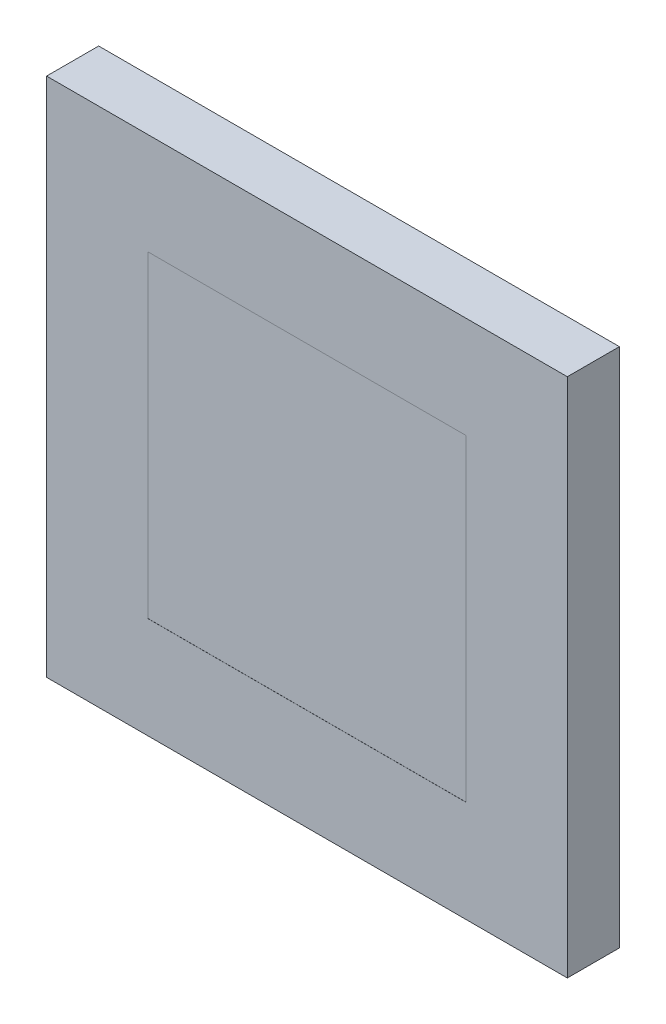
ISO-10303-21;
HEADER;
FILE_DESCRIPTION(('STEP AP214'),'2;1');
FILE_NAME('part.step','',(''),(''),'','','');
FILE_SCHEMA(('AUTOMOTIVE_DESIGN { 1 0 10303 214 1 1 1 1 }'));
ENDSEC;
DATA;
#1=APPLICATION_CONTEXT('core data for automotive mechanical design processes');
#2=APPLICATION_PROTOCOL_DEFINITION('international standard','automotive_design',2000,#1);
#3=PRODUCT_CONTEXT('',#1,'mechanical');
#4=PRODUCT('Part','Part','',(#3));
#5=PRODUCT_RELATED_PRODUCT_CATEGORY('part','',(#4));
#6=PRODUCT_DEFINITION_FORMATION('','',#4);
#7=PRODUCT_DEFINITION_CONTEXT('part definition',#1,'design');
#8=PRODUCT_DEFINITION('design','',#6,#7);
#9=PRODUCT_DEFINITION_SHAPE('','',#8);
#10=(LENGTH_UNIT() NAMED_UNIT(*) SI_UNIT(.MILLI.,.METRE.));
#11=(NAMED_UNIT(*) PLANE_ANGLE_UNIT() SI_UNIT($,.RADIAN.));
#12=(NAMED_UNIT(*) SI_UNIT($,.STERADIAN.) SOLID_ANGLE_UNIT());
#13=UNCERTAINTY_MEASURE_WITH_UNIT(LENGTH_MEASURE(1.E-05),#10,'distance_accuracy_value','');
#14=(GEOMETRIC_REPRESENTATION_CONTEXT(3) GLOBAL_UNCERTAINTY_ASSIGNED_CONTEXT((#13)) GLOBAL_UNIT_ASSIGNED_CONTEXT((#10,
#11,#12)) REPRESENTATION_CONTEXT('',''));
#15=CARTESIAN_POINT('',(0.,0.,0.));
#16=DIRECTION('',(0.,0.,1.));
#17=DIRECTION('',(1.,0.,0.));
#18=AXIS2_PLACEMENT_3D('',#15,#16,#17);
#19=CARTESIAN_POINT('',(0.,0.,50.));
#20=DIRECTION('',(1.,0.,0.));
#21=DIRECTION('',(0.,0.,-1.));
#22=AXIS2_PLACEMENT_3D('',#19,#20,#21);
#23=PLANE('',#22);
#24=DIRECTION('',(0.,-1.,0.));
#25=VECTOR('',#24,1.);
#26=CARTESIAN_POINT('',(0.,0.,0.));
#27=LINE('',#26,#25);
#28=CARTESIAN_POINT('',(0.,500.,0.));
#29=VERTEX_POINT('',#28);
#30=CARTESIAN_POINT('',(0.,0.,0.));
#31=VERTEX_POINT('',#30);
#32=EDGE_CURVE('E141',#29,#31,#27,.T.);
#33=ORIENTED_EDGE('',*,*,#32,.T.);
#34=DIRECTION('',(0.,0.,-1.));
#35=VECTOR('',#34,1.);
#36=CARTESIAN_POINT('',(0.,0.,50.));
#37=LINE('',#36,#35);
#38=CARTESIAN_POINT('',(0.,0.,50.));
#39=VERTEX_POINT('',#38);
#40=EDGE_CURVE('E11',#39,#31,#37,.T.);
#41=ORIENTED_EDGE('',*,*,#40,.F.);
#42=DIRECTION('',(0.,-1.,0.));
#43=VECTOR('',#42,1.);
#44=CARTESIAN_POINT('',(0.,0.,50.));
#45=LINE('',#44,#43);
#46=CARTESIAN_POINT('',(0.,500.,50.));
#47=VERTEX_POINT('',#46);
#48=EDGE_CURVE('E145',#47,#39,#45,.T.);
#49=ORIENTED_EDGE('',*,*,#48,.F.);
#50=DIRECTION('',(0.,0.,-1.));
#51=VECTOR('',#50,1.);
#52=CARTESIAN_POINT('',(0.,500.,50.));
#53=LINE('',#52,#51);
#54=EDGE_CURVE('E151',#47,#29,#53,.T.);
#55=ORIENTED_EDGE('',*,*,#54,.T.);
#56=EDGE_LOOP('',(#33,#41,#49,#55));
#57=FACE_BOUND('',#56,.T.);
#58=ADVANCED_FACE('F33',(#57),#23,.F.);
#59=CARTESIAN_POINT('',(0.,0.,50.));
#60=DIRECTION('',(0.,1.,0.));
#61=DIRECTION('',(0.,0.,1.));
#62=AXIS2_PLACEMENT_3D('',#59,#60,#61);
#63=PLANE('',#62);
#64=DIRECTION('',(1.,0.,0.));
#65=VECTOR('',#64,1.);
#66=CARTESIAN_POINT('',(0.,0.,0.));
#67=LINE('',#66,#65);
#68=CARTESIAN_POINT('',(500.,0.,0.));
#69=VERTEX_POINT('',#68);
#70=EDGE_CURVE('E154',#31,#69,#67,.T.);
#71=ORIENTED_EDGE('',*,*,#70,.T.);
#72=DIRECTION('',(0.,0.,-1.));
#73=VECTOR('',#72,1.);
#74=CARTESIAN_POINT('',(500.,0.,50.));
#75=LINE('',#74,#73);
#76=CARTESIAN_POINT('',(500.,0.,50.));
#77=VERTEX_POINT('',#76);
#78=EDGE_CURVE('E40',#77,#69,#75,.T.);
#79=ORIENTED_EDGE('',*,*,#78,.F.);
#80=DIRECTION('',(1.,0.,0.));
#81=VECTOR('',#80,1.);
#82=CARTESIAN_POINT('',(0.,0.,50.));
#83=LINE('',#82,#81);
#84=EDGE_CURVE('E84',#39,#77,#83,.T.);
#85=ORIENTED_EDGE('',*,*,#84,.F.);
#86=ORIENTED_EDGE('',*,*,#40,.T.);
#87=EDGE_LOOP('',(#71,#79,#85,#86));
#88=FACE_BOUND('',#87,.T.);
#89=ADVANCED_FACE('F183',(#88),#63,.F.);
#90=CARTESIAN_POINT('',(500.,0.,50.));
#91=DIRECTION('',(-1.,0.,0.));
#92=DIRECTION('',(0.,0.,1.));
#93=AXIS2_PLACEMENT_3D('',#90,#91,#92);
#94=PLANE('',#93);
#95=DIRECTION('',(0.,1.,0.));
#96=VECTOR('',#95,1.);
#97=CARTESIAN_POINT('',(500.,0.,0.));
#98=LINE('',#97,#96);
#99=CARTESIAN_POINT('',(500.,500.,0.));
#100=VERTEX_POINT('',#99);
#101=EDGE_CURVE('E156',#69,#100,#98,.T.);
#102=ORIENTED_EDGE('',*,*,#101,.T.);
#103=DIRECTION('',(0.,0.,-1.));
#104=VECTOR('',#103,1.);
#105=CARTESIAN_POINT('',(500.,500.,50.));
#106=LINE('',#105,#104);
#107=CARTESIAN_POINT('',(500.,500.,50.));
#108=VERTEX_POINT('',#107);
#109=EDGE_CURVE('E160',#108,#100,#106,.T.);
#110=ORIENTED_EDGE('',*,*,#109,.F.);
#111=DIRECTION('',(0.,1.,0.));
#112=VECTOR('',#111,1.);
#113=CARTESIAN_POINT('',(500.,0.,50.));
#114=LINE('',#113,#112);
#115=EDGE_CURVE('E148',#77,#108,#114,.T.);
#116=ORIENTED_EDGE('',*,*,#115,.F.);
#117=ORIENTED_EDGE('',*,*,#78,.T.);
#118=EDGE_LOOP('',(#102,#110,#116,#117));
#119=FACE_BOUND('',#118,.T.);
#120=ADVANCED_FACE('F165',(#119),#94,.F.);
#121=CARTESIAN_POINT('',(0.,500.,50.));
#122=DIRECTION('',(0.,-1.,0.));
#123=DIRECTION('',(0.,0.,-1.));
#124=AXIS2_PLACEMENT_3D('',#121,#122,#123);
#125=PLANE('',#124);
#126=DIRECTION('',(-1.,0.,0.));
#127=VECTOR('',#126,1.);
#128=CARTESIAN_POINT('',(0.,500.,0.));
#129=LINE('',#128,#127);
#130=EDGE_CURVE('E77',#100,#29,#129,.T.);
#131=ORIENTED_EDGE('',*,*,#130,.T.);
#132=ORIENTED_EDGE('',*,*,#54,.F.);
#133=DIRECTION('',(-1.,0.,0.));
#134=VECTOR('',#133,1.);
#135=CARTESIAN_POINT('',(0.,500.,50.));
#136=LINE('',#135,#134);
#137=EDGE_CURVE('E56',#108,#47,#136,.T.);
#138=ORIENTED_EDGE('',*,*,#137,.F.);
#139=ORIENTED_EDGE('',*,*,#109,.T.);
#140=EDGE_LOOP('',(#131,#132,#138,#139));
#141=FACE_BOUND('',#140,.T.);
#142=ADVANCED_FACE('F173',(#141),#125,.F.);
#143=CARTESIAN_POINT('',(0.,0.,50.));
#144=DIRECTION('',(0.,0.,-1.));
#145=DIRECTION('',(-1.,0.,0.));
#146=AXIS2_PLACEMENT_3D('',#143,#144,#145);
#147=PLANE('',#146);
#148=DIRECTION('',(1.,0.,0.));
#149=VECTOR('',#148,1.);
#150=CARTESIAN_POINT('',(97.5,97.5,50.));
#151=LINE('',#150,#149);
#152=CARTESIAN_POINT('',(97.5,97.5,50.));
#153=VERTEX_POINT('',#152);
#154=CARTESIAN_POINT('',(402.5,97.5,50.));
#155=VERTEX_POINT('',#154);
#156=EDGE_CURVE('E135',#153,#155,#151,.T.);
#157=ORIENTED_EDGE('',*,*,#156,.F.);
#158=DIRECTION('',(0.,-1.,0.));
#159=VECTOR('',#158,1.);
#160=CARTESIAN_POINT('',(97.5,97.5,50.));
#161=LINE('',#160,#159);
#162=CARTESIAN_POINT('',(97.5,402.5,50.));
#163=VERTEX_POINT('',#162);
#164=EDGE_CURVE('E47',#163,#153,#161,.T.);
#165=ORIENTED_EDGE('',*,*,#164,.F.);
#166=DIRECTION('',(-1.,0.,0.));
#167=VECTOR('',#166,1.);
#168=CARTESIAN_POINT('',(97.5,402.5,50.));
#169=LINE('',#168,#167);
#170=CARTESIAN_POINT('',(402.5,402.5,50.));
#171=VERTEX_POINT('',#170);
#172=EDGE_CURVE('E126',#171,#163,#169,.T.);
#173=ORIENTED_EDGE('',*,*,#172,.F.);
#174=DIRECTION('',(0.,1.,0.));
#175=VECTOR('',#174,1.);
#176=CARTESIAN_POINT('',(402.5,97.5,50.));
#177=LINE('',#176,#175);
#178=EDGE_CURVE('E129',#155,#171,#177,.T.);
#179=ORIENTED_EDGE('',*,*,#178,.F.);
#180=EDGE_LOOP('',(#157,#165,#173,#179));
#181=FACE_BOUND('',#180,.T.);
#182=ORIENTED_EDGE('',*,*,#48,.T.);
#183=ORIENTED_EDGE('',*,*,#84,.T.);
#184=ORIENTED_EDGE('',*,*,#115,.T.);
#185=ORIENTED_EDGE('',*,*,#137,.T.);
#186=EDGE_LOOP('',(#182,#183,#184,#185));
#187=FACE_BOUND('',#186,.T.);
#188=ADVANCED_FACE('F175',(#181,#187),#147,.F.);
#189=CARTESIAN_POINT('',(0.,0.,0.));
#190=DIRECTION('',(0.,0.,-1.));
#191=DIRECTION('',(-1.,0.,0.));
#192=AXIS2_PLACEMENT_3D('',#189,#190,#191);
#193=PLANE('',#192);
#194=ORIENTED_EDGE('',*,*,#32,.F.);
#195=ORIENTED_EDGE('',*,*,#130,.F.);
#196=ORIENTED_EDGE('',*,*,#101,.F.);
#197=ORIENTED_EDGE('',*,*,#70,.F.);
#198=EDGE_LOOP('',(#194,#195,#196,#197));
#199=FACE_BOUND('',#198,.T.);
#200=ADVANCED_FACE('F169',(#199),#193,.T.);
#201=CARTESIAN_POINT('',(97.5,97.5,49.9));
#202=DIRECTION('',(-1.,0.,0.));
#203=DIRECTION('',(0.,0.,1.));
#204=AXIS2_PLACEMENT_3D('',#201,#202,#203);
#205=PLANE('',#204);
#206=ORIENTED_EDGE('',*,*,#164,.T.);
#207=DIRECTION('',(0.,0.,1.));
#208=VECTOR('',#207,1.);
#209=CARTESIAN_POINT('',(97.5,97.5,49.9));
#210=LINE('',#209,#208);
#211=CARTESIAN_POINT('',(97.5,97.5,49.9));
#212=VERTEX_POINT('',#211);
#213=EDGE_CURVE('E104',#212,#153,#210,.T.);
#214=ORIENTED_EDGE('',*,*,#213,.F.);
#215=DIRECTION('',(0.,-1.,0.));
#216=VECTOR('',#215,1.);
#217=CARTESIAN_POINT('',(97.5,97.5,49.9));
#218=LINE('',#217,#216);
#219=CARTESIAN_POINT('',(97.5,402.5,49.9));
#220=VERTEX_POINT('',#219);
#221=EDGE_CURVE('E108',#220,#212,#218,.T.);
#222=ORIENTED_EDGE('',*,*,#221,.F.);
#223=DIRECTION('',(0.,0.,1.));
#224=VECTOR('',#223,1.);
#225=CARTESIAN_POINT('',(97.5,402.5,49.9));
#226=LINE('',#225,#224);
#227=EDGE_CURVE('E139',#220,#163,#226,.T.);
#228=ORIENTED_EDGE('',*,*,#227,.T.);
#229=EDGE_LOOP('',(#206,#214,#222,#228));
#230=FACE_BOUND('',#229,.T.);
#231=ADVANCED_FACE('F106',(#230),#205,.F.);
#232=CARTESIAN_POINT('',(97.5,402.5,49.9));
#233=DIRECTION('',(0.,1.,0.));
#234=DIRECTION('',(0.,0.,1.));
#235=AXIS2_PLACEMENT_3D('',#232,#233,#234);
#236=PLANE('',#235);
#237=ORIENTED_EDGE('',*,*,#172,.T.);
#238=ORIENTED_EDGE('',*,*,#227,.F.);
#239=DIRECTION('',(-1.,0.,0.));
#240=VECTOR('',#239,1.);
#241=CARTESIAN_POINT('',(97.5,402.5,49.9));
#242=LINE('',#241,#240);
#243=CARTESIAN_POINT('',(402.5,402.5,49.9));
#244=VERTEX_POINT('',#243);
#245=EDGE_CURVE('E114',#244,#220,#242,.T.);
#246=ORIENTED_EDGE('',*,*,#245,.F.);
#247=DIRECTION('',(0.,0.,1.));
#248=VECTOR('',#247,1.);
#249=CARTESIAN_POINT('',(402.5,402.5,49.9));
#250=LINE('',#249,#248);
#251=EDGE_CURVE('E142',#244,#171,#250,.T.);
#252=ORIENTED_EDGE('',*,*,#251,.T.);
#253=EDGE_LOOP('',(#237,#238,#246,#252));
#254=FACE_BOUND('',#253,.T.);
#255=ADVANCED_FACE('F222',(#254),#236,.F.);
#256=CARTESIAN_POINT('',(402.5,97.5,49.9));
#257=DIRECTION('',(1.,0.,0.));
#258=DIRECTION('',(0.,0.,-1.));
#259=AXIS2_PLACEMENT_3D('',#256,#257,#258);
#260=PLANE('',#259);
#261=ORIENTED_EDGE('',*,*,#178,.T.);
#262=ORIENTED_EDGE('',*,*,#251,.F.);
#263=DIRECTION('',(0.,1.,0.));
#264=VECTOR('',#263,1.);
#265=CARTESIAN_POINT('',(402.5,97.5,49.9));
#266=LINE('',#265,#264);
#267=CARTESIAN_POINT('',(402.5,97.5,49.9));
#268=VERTEX_POINT('',#267);
#269=EDGE_CURVE('E122',#268,#244,#266,.T.);
#270=ORIENTED_EDGE('',*,*,#269,.F.);
#271=DIRECTION('',(0.,0.,1.));
#272=VECTOR('',#271,1.);
#273=CARTESIAN_POINT('',(402.5,97.5,49.9));
#274=LINE('',#273,#272);
#275=EDGE_CURVE('E113',#268,#155,#274,.T.);
#276=ORIENTED_EDGE('',*,*,#275,.T.);
#277=EDGE_LOOP('',(#261,#262,#270,#276));
#278=FACE_BOUND('',#277,.T.);
#279=ADVANCED_FACE('F231',(#278),#260,.F.);
#280=CARTESIAN_POINT('',(97.5,97.5,49.9));
#281=DIRECTION('',(0.,-1.,0.));
#282=DIRECTION('',(1.,0.,0.));
#283=AXIS2_PLACEMENT_3D('',#280,#281,#282);
#284=PLANE('',#283);
#285=ORIENTED_EDGE('',*,*,#156,.T.);
#286=ORIENTED_EDGE('',*,*,#275,.F.);
#287=DIRECTION('',(1.,0.,0.));
#288=VECTOR('',#287,1.);
#289=CARTESIAN_POINT('',(97.5,97.5,49.9));
#290=LINE('',#289,#288);
#291=EDGE_CURVE('E117',#212,#268,#290,.T.);
#292=ORIENTED_EDGE('',*,*,#291,.F.);
#293=ORIENTED_EDGE('',*,*,#213,.T.);
#294=EDGE_LOOP('',(#285,#286,#292,#293));
#295=FACE_BOUND('',#294,.T.);
#296=ADVANCED_FACE('F118',(#295),#284,.F.);
#297=CARTESIAN_POINT('',(0.,0.,49.9));
#298=DIRECTION('',(0.,0.,-1.));
#299=DIRECTION('',(-1.,0.,0.));
#300=AXIS2_PLACEMENT_3D('',#297,#298,#299);
#301=PLANE('',#300);
#302=ORIENTED_EDGE('',*,*,#221,.T.);
#303=ORIENTED_EDGE('',*,*,#291,.T.);
#304=ORIENTED_EDGE('',*,*,#269,.T.);
#305=ORIENTED_EDGE('',*,*,#245,.T.);
#306=EDGE_LOOP('',(#302,#303,#304,#305));
#307=FACE_BOUND('',#306,.T.);
#308=ADVANCED_FACE('F124',(#307),#301,.F.);
#309=CLOSED_SHELL('',(#58,#89,#120,#142,#188,#200,#231,#255,#279,#296,#308));
#310=MANIFOLD_SOLID_BREP('B2',#309);
#311=ADVANCED_BREP_SHAPE_REPRESENTATION('',(#18,#310),#14);
#312=SHAPE_DEFINITION_REPRESENTATION(#9,#311);
ENDSEC;
END-ISO-10303-21;
